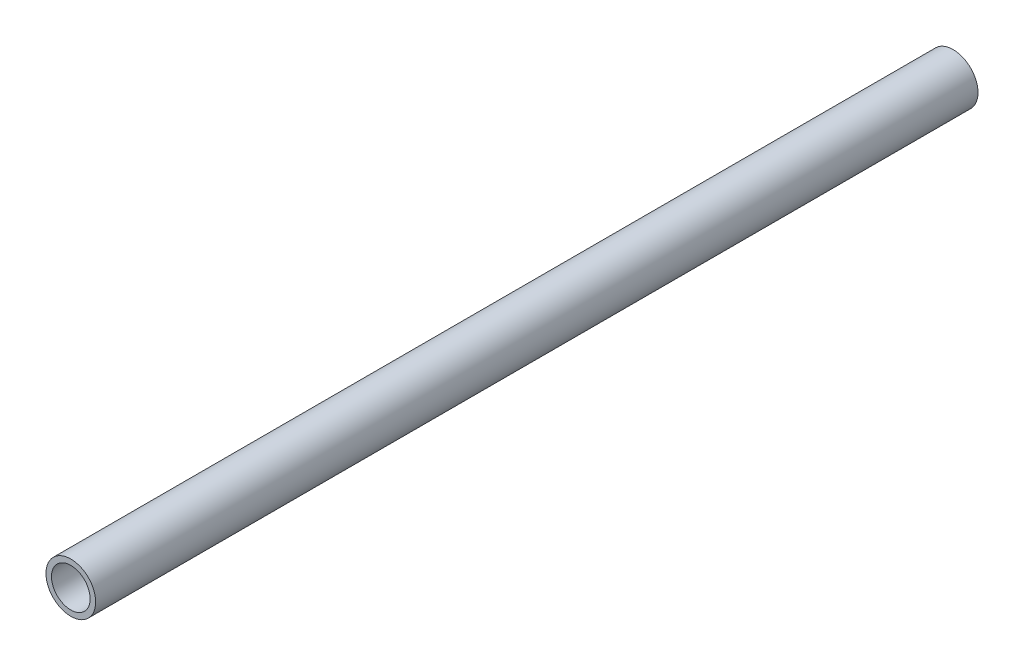
ISO-10303-21;
HEADER;
FILE_DESCRIPTION(('STEP AP214'),'2;1');
FILE_NAME('part.step','',(''),(''),'','','');
FILE_SCHEMA(('AUTOMOTIVE_DESIGN { 1 0 10303 214 1 1 1 1 }'));
ENDSEC;
DATA;
#1=APPLICATION_CONTEXT('core data for automotive mechanical design processes');
#2=APPLICATION_PROTOCOL_DEFINITION('international standard','automotive_design',2000,#1);
#3=PRODUCT_CONTEXT('',#1,'mechanical');
#4=PRODUCT('Part','Part','',(#3));
#5=PRODUCT_RELATED_PRODUCT_CATEGORY('part','',(#4));
#6=PRODUCT_DEFINITION_FORMATION('','',#4);
#7=PRODUCT_DEFINITION_CONTEXT('part definition',#1,'design');
#8=PRODUCT_DEFINITION('design','',#6,#7);
#9=PRODUCT_DEFINITION_SHAPE('','',#8);
#10=(LENGTH_UNIT() NAMED_UNIT(*) SI_UNIT(.MILLI.,.METRE.));
#11=(NAMED_UNIT(*) PLANE_ANGLE_UNIT() SI_UNIT($,.RADIAN.));
#12=(NAMED_UNIT(*) SI_UNIT($,.STERADIAN.) SOLID_ANGLE_UNIT());
#13=UNCERTAINTY_MEASURE_WITH_UNIT(LENGTH_MEASURE(1.E-05),#10,'distance_accuracy_value','');
#14=(GEOMETRIC_REPRESENTATION_CONTEXT(3) GLOBAL_UNCERTAINTY_ASSIGNED_CONTEXT((#13)) GLOBAL_UNIT_ASSIGNED_CONTEXT((#10,
#11,#12)) REPRESENTATION_CONTEXT('',''));
#15=CARTESIAN_POINT('',(0.,0.,0.));
#16=DIRECTION('',(0.,0.,1.));
#17=DIRECTION('',(1.,0.,0.));
#18=AXIS2_PLACEMENT_3D('',#15,#16,#17);
#19=CARTESIAN_POINT('',(0.,0.,319.6));
#20=DIRECTION('',(0.,0.,1.));
#21=DIRECTION('',(1.,0.,0.));
#22=AXIS2_PLACEMENT_3D('',#19,#20,#21);
#23=PLANE('',#22);
#24=CARTESIAN_POINT('',(0.,0.,319.6));
#25=DIRECTION('',(0.,0.,1.));
#26=DIRECTION('',(1.,0.,0.));
#27=AXIS2_PLACEMENT_3D('',#24,#25,#26);
#28=CIRCLE('',#27,9.);
#29=CARTESIAN_POINT('',(9.,0.,319.6));
#30=VERTEX_POINT('',#29);
#31=EDGE_CURVE('E10',#30,#30,#28,.T.);
#32=ORIENTED_EDGE('',*,*,#31,.T.);
#33=EDGE_LOOP('',(#32));
#34=FACE_BOUND('',#33,.T.);
#35=CARTESIAN_POINT('',(0.,0.,319.6));
#36=DIRECTION('',(0.,0.,1.));
#37=DIRECTION('',(1.,0.,0.));
#38=AXIS2_PLACEMENT_3D('',#35,#36,#37);
#39=CIRCLE('',#38,7.);
#40=CARTESIAN_POINT('',(7.,0.,319.6));
#41=VERTEX_POINT('',#40);
#42=EDGE_CURVE('E44',#41,#41,#39,.T.);
#43=ORIENTED_EDGE('',*,*,#42,.F.);
#44=EDGE_LOOP('',(#43));
#45=FACE_BOUND('',#44,.T.);
#46=ADVANCED_FACE('F33',(#34,#45),#23,.T.);
#47=CARTESIAN_POINT('',(0.,0.,0.));
#48=DIRECTION('',(0.,0.,1.));
#49=DIRECTION('',(1.,0.,0.));
#50=AXIS2_PLACEMENT_3D('',#47,#48,#49);
#51=PLANE('',#50);
#52=CARTESIAN_POINT('',(0.,0.,0.));
#53=DIRECTION('',(0.,0.,1.));
#54=DIRECTION('',(1.,0.,0.));
#55=AXIS2_PLACEMENT_3D('',#52,#53,#54);
#56=CIRCLE('',#55,9.);
#57=CARTESIAN_POINT('',(9.,0.,0.));
#58=VERTEX_POINT('',#57);
#59=EDGE_CURVE('E37',#58,#58,#56,.T.);
#60=ORIENTED_EDGE('',*,*,#59,.F.);
#61=EDGE_LOOP('',(#60));
#62=FACE_BOUND('',#61,.T.);
#63=CARTESIAN_POINT('',(0.,0.,0.));
#64=DIRECTION('',(0.,0.,1.));
#65=DIRECTION('',(1.,0.,0.));
#66=AXIS2_PLACEMENT_3D('',#63,#64,#65);
#67=CIRCLE('',#66,7.);
#68=CARTESIAN_POINT('',(7.,0.,0.));
#69=VERTEX_POINT('',#68);
#70=EDGE_CURVE('E46',#69,#69,#67,.T.);
#71=ORIENTED_EDGE('',*,*,#70,.T.);
#72=EDGE_LOOP('',(#71));
#73=FACE_BOUND('',#72,.T.);
#74=ADVANCED_FACE('F56',(#62,#73),#51,.F.);
#75=CARTESIAN_POINT('',(0.,0.,319.6));
#76=DIRECTION('',(0.,0.,-1.));
#77=DIRECTION('',(-1.,0.,0.));
#78=AXIS2_PLACEMENT_3D('',#75,#76,#77);
#79=CYLINDRICAL_SURFACE('',#78,9.);
#80=ORIENTED_EDGE('',*,*,#31,.F.);
#81=EDGE_LOOP('',(#80));
#82=FACE_BOUND('',#81,.T.);
#83=ORIENTED_EDGE('',*,*,#59,.T.);
#84=EDGE_LOOP('',(#83));
#85=FACE_BOUND('',#84,.T.);
#86=ADVANCED_FACE('F35',(#82,#85),#79,.T.);
#87=CARTESIAN_POINT('',(0.,0.,319.6));
#88=DIRECTION('',(0.,0.,-1.));
#89=DIRECTION('',(-1.,0.,0.));
#90=AXIS2_PLACEMENT_3D('',#87,#88,#89);
#91=CYLINDRICAL_SURFACE('',#90,7.);
#92=ORIENTED_EDGE('',*,*,#42,.T.);
#93=EDGE_LOOP('',(#92));
#94=FACE_BOUND('',#93,.T.);
#95=ORIENTED_EDGE('',*,*,#70,.F.);
#96=EDGE_LOOP('',(#95));
#97=FACE_BOUND('',#96,.T.);
#98=ADVANCED_FACE('F52',(#94,#97),#91,.F.);
#99=CLOSED_SHELL('',(#46,#74,#86,#98));
#100=MANIFOLD_SOLID_BREP('B2',#99);
#101=ADVANCED_BREP_SHAPE_REPRESENTATION('',(#18,#100),#14);
#102=SHAPE_DEFINITION_REPRESENTATION(#9,#101);
ENDSEC;
END-ISO-10303-21;
